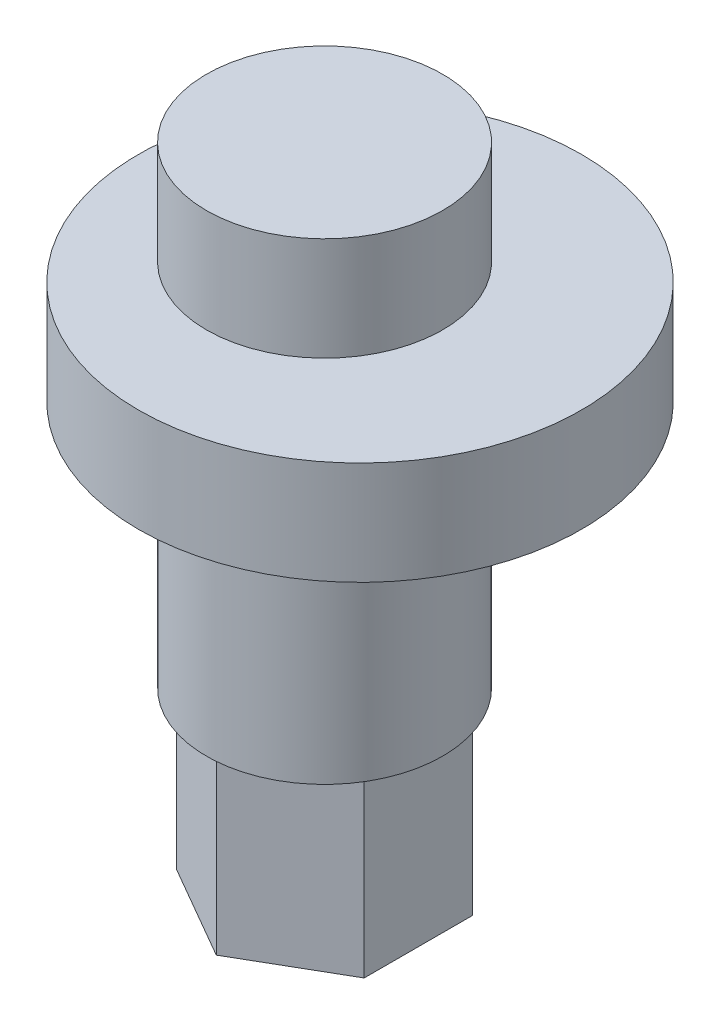
ISO-10303-21;
HEADER;
FILE_DESCRIPTION(('STEP AP214'),'2;1');
FILE_NAME('part.step','',(''),(''),'','','');
FILE_SCHEMA(('AUTOMOTIVE_DESIGN { 1 0 10303 214 1 1 1 1 }'));
ENDSEC;
DATA;
#1=APPLICATION_CONTEXT('core data for automotive mechanical design processes');
#2=APPLICATION_PROTOCOL_DEFINITION('international standard','automotive_design',2000,#1);
#3=PRODUCT_CONTEXT('',#1,'mechanical');
#4=PRODUCT('Part','Part','',(#3));
#5=PRODUCT_RELATED_PRODUCT_CATEGORY('part','',(#4));
#6=PRODUCT_DEFINITION_FORMATION('','',#4);
#7=PRODUCT_DEFINITION_CONTEXT('part definition',#1,'design');
#8=PRODUCT_DEFINITION('design','',#6,#7);
#9=PRODUCT_DEFINITION_SHAPE('','',#8);
#10=(LENGTH_UNIT() NAMED_UNIT(*) SI_UNIT(.MILLI.,.METRE.));
#11=(NAMED_UNIT(*) PLANE_ANGLE_UNIT() SI_UNIT($,.RADIAN.));
#12=(NAMED_UNIT(*) SI_UNIT($,.STERADIAN.) SOLID_ANGLE_UNIT());
#13=UNCERTAINTY_MEASURE_WITH_UNIT(LENGTH_MEASURE(1.E-05),#10,'distance_accuracy_value','');
#14=(GEOMETRIC_REPRESENTATION_CONTEXT(3) GLOBAL_UNCERTAINTY_ASSIGNED_CONTEXT((#13)) GLOBAL_UNIT_ASSIGNED_CONTEXT((#10,
#11,#12)) REPRESENTATION_CONTEXT('',''));
#15=CARTESIAN_POINT('',(0.,0.,0.));
#16=DIRECTION('',(0.,0.,1.));
#17=DIRECTION('',(1.,0.,0.));
#18=AXIS2_PLACEMENT_3D('',#15,#16,#17);
#19=CARTESIAN_POINT('',(0.,-15.,0.));
#20=DIRECTION('',(0.,1.,0.));
#21=DIRECTION('',(0.,0.,1.));
#22=AXIS2_PLACEMENT_3D('',#19,#20,#21);
#23=CYLINDRICAL_SURFACE('',#22,4.);
#24=CARTESIAN_POINT('',(0.,0.,0.));
#25=DIRECTION('',(0.,-1.,0.));
#26=DIRECTION('',(0.,0.,-1.));
#27=AXIS2_PLACEMENT_3D('',#24,#25,#26);
#28=CIRCLE('',#27,4.);
#29=CARTESIAN_POINT('',(0.,0.,-4.));
#30=VERTEX_POINT('',#29);
#31=EDGE_CURVE('E43',#30,#30,#28,.T.);
#32=ORIENTED_EDGE('',*,*,#31,.T.);
#33=EDGE_LOOP('',(#32));
#34=FACE_BOUND('',#33,.T.);
#35=CARTESIAN_POINT('',(0.,-9.,0.));
#36=DIRECTION('',(0.,-1.,0.));
#37=DIRECTION('',(0.,0.,-1.));
#38=AXIS2_PLACEMENT_3D('',#35,#36,#37);
#39=CIRCLE('',#38,4.);
#40=CARTESIAN_POINT('',(0.,-9.,-4.));
#41=VERTEX_POINT('',#40);
#42=EDGE_CURVE('E38',#41,#41,#39,.T.);
#43=ORIENTED_EDGE('',*,*,#42,.F.);
#44=EDGE_LOOP('',(#43));
#45=FACE_BOUND('',#44,.T.);
#46=ADVANCED_FACE('F34',(#34,#45),#23,.T.);
#47=CARTESIAN_POINT('',(1.2,3.5,0.));
#48=DIRECTION('',(0.,-1.,0.));
#49=DIRECTION('',(0.,0.,-1.));
#50=AXIS2_PLACEMENT_3D('',#47,#48,#49);
#51=CYLINDRICAL_SURFACE('',#50,7.5);
#52=CARTESIAN_POINT('',(1.2,3.5,0.));
#53=DIRECTION('',(0.,1.,0.));
#54=DIRECTION('',(0.,0.,1.));
#55=AXIS2_PLACEMENT_3D('',#52,#53,#54);
#56=CIRCLE('',#55,7.5);
#57=CARTESIAN_POINT('',(1.2,3.5,7.5));
#58=VERTEX_POINT('',#57);
#59=EDGE_CURVE('E149',#58,#58,#56,.T.);
#60=ORIENTED_EDGE('',*,*,#59,.F.);
#61=EDGE_LOOP('',(#60));
#62=FACE_BOUND('',#61,.T.);
#63=CARTESIAN_POINT('',(1.2,0.,0.));
#64=DIRECTION('',(0.,1.,0.));
#65=DIRECTION('',(0.,0.,1.));
#66=AXIS2_PLACEMENT_3D('',#63,#64,#65);
#67=CIRCLE('',#66,7.5);
#68=CARTESIAN_POINT('',(1.2,0.,7.5));
#69=VERTEX_POINT('',#68);
#70=EDGE_CURVE('E145',#69,#69,#67,.T.);
#71=ORIENTED_EDGE('',*,*,#70,.T.);
#72=EDGE_LOOP('',(#71));
#73=FACE_BOUND('',#72,.T.);
#74=ADVANCED_FACE('F36',(#62,#73),#51,.T.);
#75=CARTESIAN_POINT('',(1.2,3.5,0.));
#76=DIRECTION('',(0.,1.,0.));
#77=DIRECTION('',(0.,0.,1.));
#78=AXIS2_PLACEMENT_3D('',#75,#76,#77);
#79=PLANE('',#78);
#80=CARTESIAN_POINT('',(0.,3.5,0.));
#81=DIRECTION('',(0.,1.,0.));
#82=DIRECTION('',(0.,0.,1.));
#83=AXIS2_PLACEMENT_3D('',#80,#81,#82);
#84=CIRCLE('',#83,4.);
#85=CARTESIAN_POINT('',(0.,3.5,4.));
#86=VERTEX_POINT('',#85);
#87=EDGE_CURVE('E12',#86,#86,#84,.T.);
#88=ORIENTED_EDGE('',*,*,#87,.F.);
#89=EDGE_LOOP('',(#88));
#90=FACE_BOUND('',#89,.T.);
#91=ORIENTED_EDGE('',*,*,#59,.T.);
#92=EDGE_LOOP('',(#91));
#93=FACE_BOUND('',#92,.T.);
#94=ADVANCED_FACE('F158',(#90,#93),#79,.T.);
#95=CARTESIAN_POINT('',(1.2,0.,0.));
#96=DIRECTION('',(0.,1.,0.));
#97=DIRECTION('',(0.,0.,1.));
#98=AXIS2_PLACEMENT_3D('',#95,#96,#97);
#99=PLANE('',#98);
#100=ORIENTED_EDGE('',*,*,#31,.F.);
#101=EDGE_LOOP('',(#100));
#102=FACE_BOUND('',#101,.T.);
#103=ORIENTED_EDGE('',*,*,#70,.F.);
#104=EDGE_LOOP('',(#103));
#105=FACE_BOUND('',#104,.T.);
#106=ADVANCED_FACE('F155',(#102,#105),#99,.F.);
#107=CARTESIAN_POINT('',(0.,7.,0.));
#108=DIRECTION('',(0.,-1.,0.));
#109=DIRECTION('',(0.,0.,-1.));
#110=AXIS2_PLACEMENT_3D('',#107,#108,#109);
#111=CYLINDRICAL_SURFACE('',#110,4.);
#112=CARTESIAN_POINT('',(0.,7.,0.));
#113=DIRECTION('',(0.,1.,0.));
#114=DIRECTION('',(0.,0.,1.));
#115=AXIS2_PLACEMENT_3D('',#112,#113,#114);
#116=CIRCLE('',#115,4.);
#117=CARTESIAN_POINT('',(0.,7.,4.));
#118=VERTEX_POINT('',#117);
#119=EDGE_CURVE('E143',#118,#118,#116,.T.);
#120=ORIENTED_EDGE('',*,*,#119,.F.);
#121=EDGE_LOOP('',(#120));
#122=FACE_BOUND('',#121,.T.);
#123=ORIENTED_EDGE('',*,*,#87,.T.);
#124=EDGE_LOOP('',(#123));
#125=FACE_BOUND('',#124,.T.);
#126=ADVANCED_FACE('F157',(#122,#125),#111,.T.);
#127=CARTESIAN_POINT('',(0.,7.,0.));
#128=DIRECTION('',(0.,1.,0.));
#129=DIRECTION('',(0.,0.,1.));
#130=AXIS2_PLACEMENT_3D('',#127,#128,#129);
#131=PLANE('',#130);
#132=ORIENTED_EDGE('',*,*,#119,.T.);
#133=EDGE_LOOP('',(#132));
#134=FACE_BOUND('',#133,.T.);
#135=ADVANCED_FACE('F164',(#134),#131,.T.);
#136=CARTESIAN_POINT('',(1.2,-9.,0.));
#137=DIRECTION('',(0.,-1.,0.));
#138=DIRECTION('',(0.,0.,-1.));
#139=AXIS2_PLACEMENT_3D('',#136,#137,#138);
#140=PLANE('',#139);
#141=DIRECTION('',(0.,0.,1.));
#142=VECTOR('',#141,1.);
#143=CARTESIAN_POINT('',(3.175,-9.,-1.83308710467706));
#144=LINE('',#143,#142);
#145=CARTESIAN_POINT('',(3.175,-9.,-1.83308710467706));
#146=VERTEX_POINT('',#145);
#147=CARTESIAN_POINT('',(3.175,-9.,1.83308710467706));
#148=VERTEX_POINT('',#147);
#149=EDGE_CURVE('E101',#146,#148,#144,.T.);
#150=ORIENTED_EDGE('',*,*,#149,.F.);
#151=DIRECTION('',(0.866025403784439,0.,0.5));
#152=VECTOR('',#151,1.);
#153=CARTESIAN_POINT('',(0.,-9.,-3.66617420935412));
#154=LINE('',#153,#152);
#155=CARTESIAN_POINT('',(0.,-9.,-3.66617420935412));
#156=VERTEX_POINT('',#155);
#157=EDGE_CURVE('E122',#156,#146,#154,.T.);
#158=ORIENTED_EDGE('',*,*,#157,.F.);
#159=DIRECTION('',(0.866025403784438,0.,-0.5));
#160=VECTOR('',#159,1.);
#161=CARTESIAN_POINT('',(-3.175,-9.,-1.83308710467706));
#162=LINE('',#161,#160);
#163=CARTESIAN_POINT('',(-3.175,-9.,-1.83308710467706));
#164=VERTEX_POINT('',#163);
#165=EDGE_CURVE('E119',#164,#156,#162,.T.);
#166=ORIENTED_EDGE('',*,*,#165,.F.);
#167=DIRECTION('',(0.,0.,-1.));
#168=VECTOR('',#167,1.);
#169=CARTESIAN_POINT('',(-3.175,-9.,1.83308710467706));
#170=LINE('',#169,#168);
#171=CARTESIAN_POINT('',(-3.175,-9.,1.83308710467706));
#172=VERTEX_POINT('',#171);
#173=EDGE_CURVE('E59',#172,#164,#170,.T.);
#174=ORIENTED_EDGE('',*,*,#173,.F.);
#175=DIRECTION('',(-0.866025403784439,0.,-0.5));
#176=VECTOR('',#175,1.);
#177=CARTESIAN_POINT('',(0.,-9.,3.66617420935412));
#178=LINE('',#177,#176);
#179=CARTESIAN_POINT('',(0.,-9.,3.66617420935412));
#180=VERTEX_POINT('',#179);
#181=EDGE_CURVE('E93',#180,#172,#178,.T.);
#182=ORIENTED_EDGE('',*,*,#181,.F.);
#183=DIRECTION('',(-0.866025403784439,0.,0.5));
#184=VECTOR('',#183,1.);
#185=CARTESIAN_POINT('',(3.175,-9.,1.83308710467706));
#186=LINE('',#185,#184);
#187=EDGE_CURVE('E107',#148,#180,#186,.T.);
#188=ORIENTED_EDGE('',*,*,#187,.F.);
#189=EDGE_LOOP('',(#150,#158,#166,#174,#182,#188));
#190=FACE_BOUND('',#189,.T.);
#191=ORIENTED_EDGE('',*,*,#42,.T.);
#192=EDGE_LOOP('',(#191));
#193=FACE_BOUND('',#192,.T.);
#194=ADVANCED_FACE('F105',(#190,#193),#140,.T.);
#195=CARTESIAN_POINT('',(3.175,-9.,1.83308710467706));
#196=DIRECTION('',(0.5,0.,0.866025403784439));
#197=DIRECTION('',(0.866025403784439,0.,-0.5));
#198=AXIS2_PLACEMENT_3D('',#195,#196,#197);
#199=PLANE('',#198);
#200=DIRECTION('',(-0.866025403784439,0.,0.5));
#201=VECTOR('',#200,1.);
#202=CARTESIAN_POINT('',(3.175,-15.,1.83308710467706));
#203=LINE('',#202,#201);
#204=CARTESIAN_POINT('',(3.175,-15.,1.83308710467706));
#205=VERTEX_POINT('',#204);
#206=CARTESIAN_POINT('',(0.,-15.,3.66617420935412));
#207=VERTEX_POINT('',#206);
#208=EDGE_CURVE('E126',#205,#207,#203,.T.);
#209=ORIENTED_EDGE('',*,*,#208,.F.);
#210=DIRECTION('',(0.,-1.,0.));
#211=VECTOR('',#210,1.);
#212=CARTESIAN_POINT('',(3.175,-9.,1.83308710467706));
#213=LINE('',#212,#211);
#214=EDGE_CURVE('E111',#148,#205,#213,.T.);
#215=ORIENTED_EDGE('',*,*,#214,.F.);
#216=ORIENTED_EDGE('',*,*,#187,.T.);
#217=DIRECTION('',(0.,-1.,0.));
#218=VECTOR('',#217,1.);
#219=CARTESIAN_POINT('',(0.,-9.,3.66617420935412));
#220=LINE('',#219,#218);
#221=EDGE_CURVE('E91',#180,#207,#220,.T.);
#222=ORIENTED_EDGE('',*,*,#221,.T.);
#223=EDGE_LOOP('',(#209,#215,#216,#222));
#224=FACE_BOUND('',#223,.T.);
#225=ADVANCED_FACE('F110',(#224),#199,.T.);
#226=CARTESIAN_POINT('',(3.175,-9.,-1.83308710467706));
#227=DIRECTION('',(1.,0.,0.));
#228=DIRECTION('',(0.,0.,-1.));
#229=AXIS2_PLACEMENT_3D('',#226,#227,#228);
#230=PLANE('',#229);
#231=DIRECTION('',(0.,0.,1.));
#232=VECTOR('',#231,1.);
#233=CARTESIAN_POINT('',(3.175,-15.,-1.83308710467706));
#234=LINE('',#233,#232);
#235=CARTESIAN_POINT('',(3.175,-15.,-1.83308710467706));
#236=VERTEX_POINT('',#235);
#237=EDGE_CURVE('E112',#236,#205,#234,.T.);
#238=ORIENTED_EDGE('',*,*,#237,.F.);
#239=DIRECTION('',(0.,-1.,0.));
#240=VECTOR('',#239,1.);
#241=CARTESIAN_POINT('',(3.175,-9.,-1.83308710467706));
#242=LINE('',#241,#240);
#243=EDGE_CURVE('E136',#146,#236,#242,.T.);
#244=ORIENTED_EDGE('',*,*,#243,.F.);
#245=ORIENTED_EDGE('',*,*,#149,.T.);
#246=ORIENTED_EDGE('',*,*,#214,.T.);
#247=EDGE_LOOP('',(#238,#244,#245,#246));
#248=FACE_BOUND('',#247,.T.);
#249=ADVANCED_FACE('F190',(#248),#230,.T.);
#250=CARTESIAN_POINT('',(0.,-9.,-3.66617420935412));
#251=DIRECTION('',(0.5,0.,-0.866025403784439));
#252=DIRECTION('',(-0.866025403784439,0.,-0.5));
#253=AXIS2_PLACEMENT_3D('',#250,#251,#252);
#254=PLANE('',#253);
#255=DIRECTION('',(0.866025403784439,0.,0.5));
#256=VECTOR('',#255,1.);
#257=CARTESIAN_POINT('',(0.,-15.,-3.66617420935412));
#258=LINE('',#257,#256);
#259=CARTESIAN_POINT('',(0.,-15.,-3.66617420935412));
#260=VERTEX_POINT('',#259);
#261=EDGE_CURVE('E115',#260,#236,#258,.T.);
#262=ORIENTED_EDGE('',*,*,#261,.F.);
#263=DIRECTION('',(0.,-1.,0.));
#264=VECTOR('',#263,1.);
#265=CARTESIAN_POINT('',(0.,-9.,-3.66617420935412));
#266=LINE('',#265,#264);
#267=EDGE_CURVE('E138',#156,#260,#266,.T.);
#268=ORIENTED_EDGE('',*,*,#267,.F.);
#269=ORIENTED_EDGE('',*,*,#157,.T.);
#270=ORIENTED_EDGE('',*,*,#243,.T.);
#271=EDGE_LOOP('',(#262,#268,#269,#270));
#272=FACE_BOUND('',#271,.T.);
#273=ADVANCED_FACE('F199',(#272),#254,.T.);
#274=CARTESIAN_POINT('',(-3.175,-9.,-1.83308710467706));
#275=DIRECTION('',(-0.5,0.,-0.866025403784439));
#276=DIRECTION('',(-0.866025403784439,0.,0.5));
#277=AXIS2_PLACEMENT_3D('',#274,#275,#276);
#278=PLANE('',#277);
#279=DIRECTION('',(0.866025403784438,0.,-0.5));
#280=VECTOR('',#279,1.);
#281=CARTESIAN_POINT('',(-3.175,-15.,-1.83308710467706));
#282=LINE('',#281,#280);
#283=CARTESIAN_POINT('',(-3.175,-15.,-1.83308710467706));
#284=VERTEX_POINT('',#283);
#285=EDGE_CURVE('E130',#284,#260,#282,.T.);
#286=ORIENTED_EDGE('',*,*,#285,.F.);
#287=DIRECTION('',(0.,-1.,0.));
#288=VECTOR('',#287,1.);
#289=CARTESIAN_POINT('',(-3.175,-9.,-1.83308710467706));
#290=LINE('',#289,#288);
#291=EDGE_CURVE('E140',#164,#284,#290,.T.);
#292=ORIENTED_EDGE('',*,*,#291,.F.);
#293=ORIENTED_EDGE('',*,*,#165,.T.);
#294=ORIENTED_EDGE('',*,*,#267,.T.);
#295=EDGE_LOOP('',(#286,#292,#293,#294));
#296=FACE_BOUND('',#295,.T.);
#297=ADVANCED_FACE('F196',(#296),#278,.T.);
#298=CARTESIAN_POINT('',(-3.175,-9.,1.83308710467706));
#299=DIRECTION('',(-1.,0.,0.));
#300=DIRECTION('',(0.,0.,1.));
#301=AXIS2_PLACEMENT_3D('',#298,#299,#300);
#302=PLANE('',#301);
#303=DIRECTION('',(0.,0.,-1.));
#304=VECTOR('',#303,1.);
#305=CARTESIAN_POINT('',(-3.175,-15.,1.83308710467706));
#306=LINE('',#305,#304);
#307=CARTESIAN_POINT('',(-3.175,-15.,1.83308710467706));
#308=VERTEX_POINT('',#307);
#309=EDGE_CURVE('E51',#308,#284,#306,.T.);
#310=ORIENTED_EDGE('',*,*,#309,.F.);
#311=DIRECTION('',(0.,-1.,0.));
#312=VECTOR('',#311,1.);
#313=CARTESIAN_POINT('',(-3.175,-9.,1.83308710467706));
#314=LINE('',#313,#312);
#315=EDGE_CURVE('E100',#172,#308,#314,.T.);
#316=ORIENTED_EDGE('',*,*,#315,.F.);
#317=ORIENTED_EDGE('',*,*,#173,.T.);
#318=ORIENTED_EDGE('',*,*,#291,.T.);
#319=EDGE_LOOP('',(#310,#316,#317,#318));
#320=FACE_BOUND('',#319,.T.);
#321=ADVANCED_FACE('F193',(#320),#302,.T.);
#322=CARTESIAN_POINT('',(0.,-9.,3.66617420935412));
#323=DIRECTION('',(-0.5,0.,0.866025403784439));
#324=DIRECTION('',(0.866025403784439,0.,0.5));
#325=AXIS2_PLACEMENT_3D('',#322,#323,#324);
#326=PLANE('',#325);
#327=DIRECTION('',(-0.866025403784439,0.,-0.5));
#328=VECTOR('',#327,1.);
#329=CARTESIAN_POINT('',(0.,-15.,3.66617420935412));
#330=LINE('',#329,#328);
#331=EDGE_CURVE('E95',#207,#308,#330,.T.);
#332=ORIENTED_EDGE('',*,*,#331,.F.);
#333=ORIENTED_EDGE('',*,*,#221,.F.);
#334=ORIENTED_EDGE('',*,*,#181,.T.);
#335=ORIENTED_EDGE('',*,*,#315,.T.);
#336=EDGE_LOOP('',(#332,#333,#334,#335));
#337=FACE_BOUND('',#336,.T.);
#338=ADVANCED_FACE('F92',(#337),#326,.T.);
#339=CARTESIAN_POINT('',(0.,-15.,0.));
#340=DIRECTION('',(0.,-1.,0.));
#341=DIRECTION('',(0.,0.,-1.));
#342=AXIS2_PLACEMENT_3D('',#339,#340,#341);
#343=PLANE('',#342);
#344=ORIENTED_EDGE('',*,*,#237,.T.);
#345=ORIENTED_EDGE('',*,*,#208,.T.);
#346=ORIENTED_EDGE('',*,*,#331,.T.);
#347=ORIENTED_EDGE('',*,*,#309,.T.);
#348=ORIENTED_EDGE('',*,*,#285,.T.);
#349=ORIENTED_EDGE('',*,*,#261,.T.);
#350=EDGE_LOOP('',(#344,#345,#346,#347,#348,#349));
#351=FACE_BOUND('',#350,.T.);
#352=ADVANCED_FACE('F179',(#351),#343,.T.);
#353=CLOSED_SHELL('',(#46,#74,#94,#106,#126,#135,#194,#225,#249,#273,#297,#321,#338,#352));
#354=MANIFOLD_SOLID_BREP('B2',#353);
#355=ADVANCED_BREP_SHAPE_REPRESENTATION('',(#18,#354),#14);
#356=SHAPE_DEFINITION_REPRESENTATION(#9,#355);
ENDSEC;
END-ISO-10303-21;
